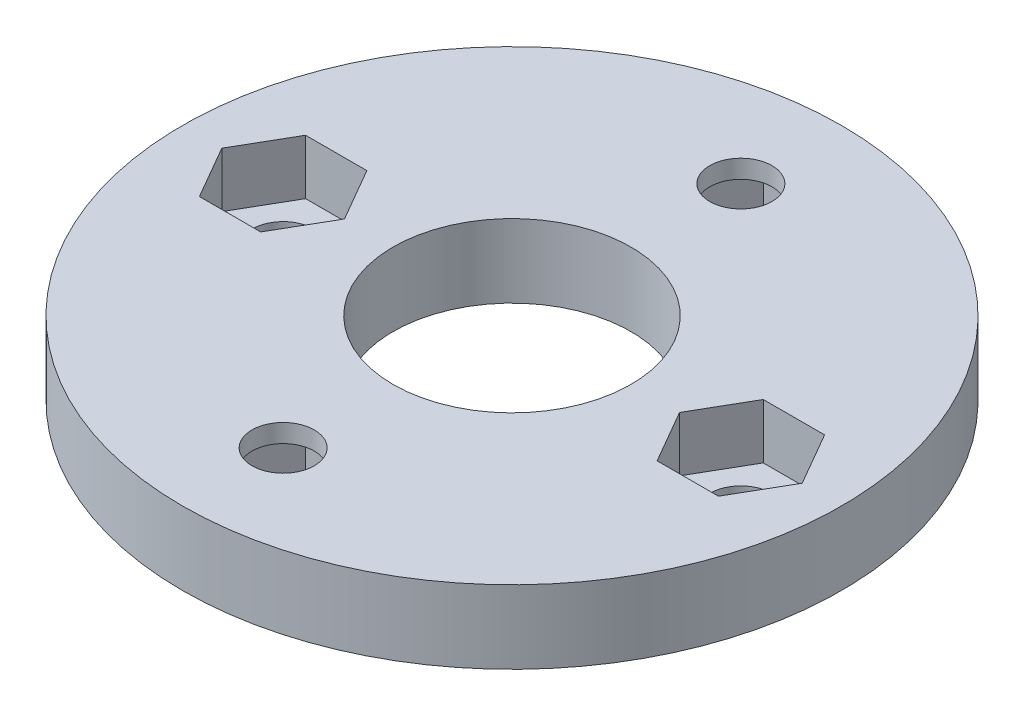
ISO-10303-21;
HEADER;
FILE_DESCRIPTION(('STEP AP214'),'2;1');
FILE_NAME('part.step','',(''),(''),'','','');
FILE_SCHEMA(('AUTOMOTIVE_DESIGN { 1 0 10303 214 1 1 1 1 }'));
ENDSEC;
DATA;
#1=APPLICATION_CONTEXT('core data for automotive mechanical design processes');
#2=APPLICATION_PROTOCOL_DEFINITION('international standard','automotive_design',2000,#1);
#3=PRODUCT_CONTEXT('',#1,'mechanical');
#4=PRODUCT('Part','Part','',(#3));
#5=PRODUCT_RELATED_PRODUCT_CATEGORY('part','',(#4));
#6=PRODUCT_DEFINITION_FORMATION('','',#4);
#7=PRODUCT_DEFINITION_CONTEXT('part definition',#1,'design');
#8=PRODUCT_DEFINITION('design','',#6,#7);
#9=PRODUCT_DEFINITION_SHAPE('','',#8);
#10=(LENGTH_UNIT() NAMED_UNIT(*) SI_UNIT(.MILLI.,.METRE.));
#11=(NAMED_UNIT(*) PLANE_ANGLE_UNIT() SI_UNIT($,.RADIAN.));
#12=(NAMED_UNIT(*) SI_UNIT($,.STERADIAN.) SOLID_ANGLE_UNIT());
#13=UNCERTAINTY_MEASURE_WITH_UNIT(LENGTH_MEASURE(1.E-05),#10,'distance_accuracy_value','');
#14=(GEOMETRIC_REPRESENTATION_CONTEXT(3) GLOBAL_UNCERTAINTY_ASSIGNED_CONTEXT((#13)) GLOBAL_UNIT_ASSIGNED_CONTEXT((#10,
#11,#12)) REPRESENTATION_CONTEXT('',''));
#15=CARTESIAN_POINT('',(0.,0.,0.));
#16=DIRECTION('',(0.,0.,1.));
#17=DIRECTION('',(1.,0.,0.));
#18=AXIS2_PLACEMENT_3D('',#15,#16,#17);
#19=CARTESIAN_POINT('',(0.,0.,-12.5));
#20=DIRECTION('',(0.,1.,0.));
#21=DIRECTION('',(0.,0.,1.));
#22=AXIS2_PLACEMENT_3D('',#19,#20,#21);
#23=CYLINDRICAL_SURFACE('',#22,1.7);
#24=CARTESIAN_POINT('',(0.,4.,-12.5));
#25=DIRECTION('',(0.,1.,0.));
#26=DIRECTION('',(1.,0.,0.));
#27=AXIS2_PLACEMENT_3D('',#24,#25,#26);
#28=CIRCLE('',#27,1.7);
#29=CARTESIAN_POINT('',(1.69999999999996,4.,-12.5));
#30=VERTEX_POINT('',#29);
#31=EDGE_CURVE('E306',#30,#30,#28,.T.);
#32=ORIENTED_EDGE('',*,*,#31,.T.);
#33=EDGE_LOOP('',(#32));
#34=FACE_BOUND('',#33,.T.);
#35=CARTESIAN_POINT('',(0.,3.,-12.5));
#36=DIRECTION('',(0.,-1.,0.));
#37=DIRECTION('',(0.,0.,-1.));
#38=AXIS2_PLACEMENT_3D('',#35,#36,#37);
#39=CIRCLE('',#38,1.7);
#40=CARTESIAN_POINT('',(0.,3.,-14.2));
#41=VERTEX_POINT('',#40);
#42=EDGE_CURVE('E38',#41,#41,#39,.F.);
#43=ORIENTED_EDGE('',*,*,#42,.F.);
#44=EDGE_LOOP('',(#43));
#45=FACE_BOUND('',#44,.T.);
#46=ADVANCED_FACE('F34',(#34,#45),#23,.F.);
#47=CARTESIAN_POINT('',(1.30930550206618E-13,0.,12.5));
#48=DIRECTION('',(0.,1.,0.));
#49=DIRECTION('',(0.,0.,1.));
#50=AXIS2_PLACEMENT_3D('',#47,#48,#49);
#51=CYLINDRICAL_SURFACE('',#50,1.7);
#52=CARTESIAN_POINT('',(1.30930550206618E-13,4.,12.5));
#53=DIRECTION('',(0.,1.,0.));
#54=DIRECTION('',(-1.,0.,0.));
#55=AXIS2_PLACEMENT_3D('',#52,#53,#54);
#56=CIRCLE('',#55,1.7);
#57=CARTESIAN_POINT('',(-1.69999999999987,4.,12.5));
#58=VERTEX_POINT('',#57);
#59=EDGE_CURVE('E303',#58,#58,#56,.T.);
#60=ORIENTED_EDGE('',*,*,#59,.T.);
#61=EDGE_LOOP('',(#60));
#62=FACE_BOUND('',#61,.T.);
#63=CARTESIAN_POINT('',(1.30930550206618E-13,3.,12.5));
#64=DIRECTION('',(0.,-1.,0.));
#65=DIRECTION('',(0.,0.,-1.));
#66=AXIS2_PLACEMENT_3D('',#63,#64,#65);
#67=CIRCLE('',#66,1.7);
#68=CARTESIAN_POINT('',(1.30930550206618E-13,3.,10.8));
#69=VERTEX_POINT('',#68);
#70=EDGE_CURVE('E246',#69,#69,#67,.F.);
#71=ORIENTED_EDGE('',*,*,#70,.F.);
#72=EDGE_LOOP('',(#71));
#73=FACE_BOUND('',#72,.T.);
#74=ADVANCED_FACE('F428',(#62,#73),#51,.F.);
#75=CARTESIAN_POINT('',(0.,4.,0.));
#76=DIRECTION('',(0.,1.,0.));
#77=DIRECTION('',(0.,0.,1.));
#78=AXIS2_PLACEMENT_3D('',#75,#76,#77);
#79=PLANE('',#78);
#80=ORIENTED_EDGE('',*,*,#59,.F.);
#81=EDGE_LOOP('',(#80));
#82=FACE_BOUND('',#81,.T.);
#83=ORIENTED_EDGE('',*,*,#31,.F.);
#84=EDGE_LOOP('',(#83));
#85=FACE_BOUND('',#84,.T.);
#86=DIRECTION('',(-0.49999994243347,0.,0.866025437020488));
#87=VECTOR('',#86,1.);
#88=CARTESIAN_POINT('',(-14.174315973419,4.,-2.8999998887047));
#89=LINE('',#88,#87);
#90=CARTESIAN_POINT('',(-14.174315973419,4.,-2.8999998887047));
#91=VERTEX_POINT('',#90);
#92=CARTESIAN_POINT('',(-15.8486315612998,4.,2.22590577046711E-07));
#93=VERTEX_POINT('',#92);
#94=EDGE_CURVE('E333',#91,#93,#89,.T.);
#95=ORIENTED_EDGE('',*,*,#94,.F.);
#96=DIRECTION('',(-0.999999999999998,0.,6.64721020233805E-08));
#97=VECTOR('',#96,1.);
#98=CARTESIAN_POINT('',(-10.8256844121192,4.,-2.90000011129528));
#99=LINE('',#98,#97);
#100=CARTESIAN_POINT('',(-10.8256844121192,4.,-2.90000011129528));
#101=VERTEX_POINT('',#100);
#102=EDGE_CURVE('E317',#101,#91,#99,.T.);
#103=ORIENTED_EDGE('',*,*,#102,.F.);
#104=DIRECTION('',(-0.500000057566528,0.,-0.866025370548386));
#105=VECTOR('',#104,1.);
#106=CARTESIAN_POINT('',(-9.15136843870021,4.,-2.22590574284896E-07));
#107=LINE('',#106,#105);
#108=CARTESIAN_POINT('',(-9.15136843870021,4.,-2.22590574284896E-07));
#109=VERTEX_POINT('',#108);
#110=EDGE_CURVE('E344',#109,#101,#107,.T.);
#111=ORIENTED_EDGE('',*,*,#110,.F.);
#112=DIRECTION('',(0.49999994243347,0.,-0.866025437020487));
#113=VECTOR('',#112,1.);
#114=CARTESIAN_POINT('',(-10.825684026581,4.,2.8999998887047));
#115=LINE('',#114,#113);
#116=CARTESIAN_POINT('',(-10.825684026581,4.,2.8999998887047));
#117=VERTEX_POINT('',#116);
#118=EDGE_CURVE('E341',#117,#109,#115,.T.);
#119=ORIENTED_EDGE('',*,*,#118,.F.);
#120=DIRECTION('',(0.999999999999998,0.,-6.64721020233805E-08));
#121=VECTOR('',#120,1.);
#122=CARTESIAN_POINT('',(-14.1743155878808,4.,2.90000011129528));
#123=LINE('',#122,#121);
#124=CARTESIAN_POINT('',(-14.1743155878808,4.,2.90000011129528));
#125=VERTEX_POINT('',#124);
#126=EDGE_CURVE('E338',#125,#117,#123,.T.);
#127=ORIENTED_EDGE('',*,*,#126,.F.);
#128=DIRECTION('',(0.500000057566528,0.,0.866025370548386));
#129=VECTOR('',#128,1.);
#130=CARTESIAN_POINT('',(-15.8486315612998,4.,2.2259057847389E-07));
#131=LINE('',#130,#129);
#132=EDGE_CURVE('E335',#93,#125,#131,.T.);
#133=ORIENTED_EDGE('',*,*,#132,.F.);
#134=EDGE_LOOP('',(#95,#103,#111,#119,#127,#133));
#135=FACE_BOUND('',#134,.T.);
#136=DIRECTION('',(0.5,0.,-0.866025403784438));
#137=VECTOR('',#136,1.);
#138=CARTESIAN_POINT('',(14.1743157806499,4.,2.90000083090127));
#139=LINE('',#138,#137);
#140=CARTESIAN_POINT('',(14.1743157806499,4.,2.90000083090127));
#141=VERTEX_POINT('',#140);
#142=CARTESIAN_POINT('',(15.8486315612998,4.,8.30901274000151E-07));
#143=VERTEX_POINT('',#142);
#144=EDGE_CURVE('E351',#141,#143,#139,.T.);
#145=ORIENTED_EDGE('',*,*,#144,.F.);
#146=DIRECTION('',(1.,0.,0.));
#147=VECTOR('',#146,1.);
#148=CARTESIAN_POINT('',(10.8256842193501,4.,2.90000083090127));
#149=LINE('',#148,#147);
#150=CARTESIAN_POINT('',(10.8256842193501,4.,2.90000083090127));
#151=VERTEX_POINT('',#150);
#152=EDGE_CURVE('E366',#151,#141,#149,.T.);
#153=ORIENTED_EDGE('',*,*,#152,.F.);
#154=DIRECTION('',(0.5,0.,0.866025403784439));
#155=VECTOR('',#154,1.);
#156=CARTESIAN_POINT('',(9.15136843870017,4.,8.30901269872044E-07));
#157=LINE('',#156,#155);
#158=CARTESIAN_POINT('',(9.15136843870017,4.,8.30901269872044E-07));
#159=VERTEX_POINT('',#158);
#160=EDGE_CURVE('E392',#159,#151,#157,.T.);
#161=ORIENTED_EDGE('',*,*,#160,.F.);
#162=DIRECTION('',(-0.5,0.,0.866025403784438));
#163=VECTOR('',#162,1.);
#164=CARTESIAN_POINT('',(10.8256842193501,4.,-2.89999916909873));
#165=LINE('',#164,#163);
#166=CARTESIAN_POINT('',(10.8256842193501,4.,-2.89999916909873));
#167=VERTEX_POINT('',#166);
#168=EDGE_CURVE('E389',#167,#159,#165,.T.);
#169=ORIENTED_EDGE('',*,*,#168,.F.);
#170=DIRECTION('',(-1.,0.,0.));
#171=VECTOR('',#170,1.);
#172=CARTESIAN_POINT('',(14.1743157806499,4.,-2.89999916909873));
#173=LINE('',#172,#171);
#174=CARTESIAN_POINT('',(14.1743157806499,4.,-2.89999916909873));
#175=VERTEX_POINT('',#174);
#176=EDGE_CURVE('E386',#175,#167,#173,.T.);
#177=ORIENTED_EDGE('',*,*,#176,.F.);
#178=DIRECTION('',(-0.5,0.,-0.866025403784439));
#179=VECTOR('',#178,1.);
#180=CARTESIAN_POINT('',(15.8486315612998,4.,8.30901274000151E-07));
#181=LINE('',#180,#179);
#182=EDGE_CURVE('E383',#143,#175,#181,.T.);
#183=ORIENTED_EDGE('',*,*,#182,.F.);
#184=EDGE_LOOP('',(#145,#153,#161,#169,#177,#183));
#185=FACE_BOUND('',#184,.T.);
#186=CARTESIAN_POINT('',(0.,4.,0.));
#187=DIRECTION('',(0.,1.,0.));
#188=DIRECTION('',(0.,0.,1.));
#189=AXIS2_PLACEMENT_3D('',#186,#187,#188);
#190=CIRCLE('',#189,18.);
#191=CARTESIAN_POINT('',(0.,4.,18.));
#192=VERTEX_POINT('',#191);
#193=EDGE_CURVE('E11',#192,#192,#190,.T.);
#194=ORIENTED_EDGE('',*,*,#193,.T.);
#195=EDGE_LOOP('',(#194));
#196=FACE_BOUND('',#195,.T.);
#197=CARTESIAN_POINT('',(0.,4.,0.));
#198=DIRECTION('',(0.,1.,0.));
#199=DIRECTION('',(0.,0.,1.));
#200=AXIS2_PLACEMENT_3D('',#197,#198,#199);
#201=CIRCLE('',#200,6.5);
#202=CARTESIAN_POINT('',(0.,4.,6.5));
#203=VERTEX_POINT('',#202);
#204=EDGE_CURVE('E410',#203,#203,#201,.T.);
#205=ORIENTED_EDGE('',*,*,#204,.F.);
#206=EDGE_LOOP('',(#205));
#207=FACE_BOUND('',#206,.T.);
#208=ADVANCED_FACE('F434',(#82,#85,#135,#185,#196,#207),#79,.T.);
#209=CARTESIAN_POINT('',(0.,0.,0.));
#210=DIRECTION('',(0.,1.,0.));
#211=DIRECTION('',(0.,0.,1.));
#212=AXIS2_PLACEMENT_3D('',#209,#210,#211);
#213=PLANE('',#212);
#214=DIRECTION('',(-0.5,0.,0.866025403784439));
#215=VECTOR('',#214,1.);
#216=CARTESIAN_POINT('',(3.34863156129983,0.,12.5));
#217=LINE('',#216,#215);
#218=CARTESIAN_POINT('',(3.34863156129983,0.,12.5));
#219=VERTEX_POINT('',#218);
#220=CARTESIAN_POINT('',(1.67431578064991,0.,15.4));
#221=VERTEX_POINT('',#220);
#222=EDGE_CURVE('E233',#219,#221,#217,.T.);
#223=ORIENTED_EDGE('',*,*,#222,.F.);
#224=DIRECTION('',(0.5,0.,0.866025403784439));
#225=VECTOR('',#224,1.);
#226=CARTESIAN_POINT('',(1.67431578064991,0.,9.6));
#227=LINE('',#226,#225);
#228=CARTESIAN_POINT('',(1.67431578064991,0.,9.6));
#229=VERTEX_POINT('',#228);
#230=EDGE_CURVE('E51',#229,#219,#227,.T.);
#231=ORIENTED_EDGE('',*,*,#230,.F.);
#232=DIRECTION('',(1.,0.,0.));
#233=VECTOR('',#232,1.);
#234=CARTESIAN_POINT('',(-1.67431578064992,0.,9.6));
#235=LINE('',#234,#233);
#236=CARTESIAN_POINT('',(-1.67431578064992,0.,9.6));
#237=VERTEX_POINT('',#236);
#238=EDGE_CURVE('E219',#237,#229,#235,.T.);
#239=ORIENTED_EDGE('',*,*,#238,.F.);
#240=DIRECTION('',(0.5,0.,-0.866025403784439));
#241=VECTOR('',#240,1.);
#242=CARTESIAN_POINT('',(-3.34863156129983,0.,12.5));
#243=LINE('',#242,#241);
#244=CARTESIAN_POINT('',(-3.34863156129983,0.,12.5));
#245=VERTEX_POINT('',#244);
#246=EDGE_CURVE('E222',#245,#237,#243,.T.);
#247=ORIENTED_EDGE('',*,*,#246,.F.);
#248=DIRECTION('',(-0.5,0.,-0.866025403784438));
#249=VECTOR('',#248,1.);
#250=CARTESIAN_POINT('',(-1.67431578064992,0.,15.4));
#251=LINE('',#250,#249);
#252=CARTESIAN_POINT('',(-1.67431578064992,0.,15.4));
#253=VERTEX_POINT('',#252);
#254=EDGE_CURVE('E239',#253,#245,#251,.T.);
#255=ORIENTED_EDGE('',*,*,#254,.F.);
#256=DIRECTION('',(-1.,0.,0.));
#257=VECTOR('',#256,1.);
#258=CARTESIAN_POINT('',(1.67431578064991,0.,15.4));
#259=LINE('',#258,#257);
#260=EDGE_CURVE('E236',#221,#253,#259,.T.);
#261=ORIENTED_EDGE('',*,*,#260,.F.);
#262=EDGE_LOOP('',(#223,#231,#239,#247,#255,#261));
#263=FACE_BOUND('',#262,.T.);
#264=DIRECTION('',(0.500000000000006,0.,-0.866025403784435));
#265=VECTOR('',#264,1.);
#266=CARTESIAN_POINT('',(-3.34863156129974,0.,-12.5));
#267=LINE('',#266,#265);
#268=CARTESIAN_POINT('',(-3.34863156129974,0.,-12.5));
#269=VERTEX_POINT('',#268);
#270=CARTESIAN_POINT('',(-1.67431578064981,0.,-15.4));
#271=VERTEX_POINT('',#270);
#272=EDGE_CURVE('E275',#269,#271,#267,.T.);
#273=ORIENTED_EDGE('',*,*,#272,.F.);
#274=DIRECTION('',(-0.499999999999994,0.,-0.866025403784442));
#275=VECTOR('',#274,1.);
#276=CARTESIAN_POINT('',(-1.67431578064985,0.,-9.60000000000001));
#277=LINE('',#276,#275);
#278=CARTESIAN_POINT('',(-1.67431578064985,0.,-9.60000000000001));
#279=VERTEX_POINT('',#278);
#280=EDGE_CURVE('E59',#279,#269,#277,.T.);
#281=ORIENTED_EDGE('',*,*,#280,.F.);
#282=DIRECTION('',(-1.,0.,0.));
#283=VECTOR('',#282,1.);
#284=CARTESIAN_POINT('',(1.67431578064998,0.,-9.59999999999999));
#285=LINE('',#284,#283);
#286=CARTESIAN_POINT('',(1.67431578064998,0.,-9.59999999999999));
#287=VERTEX_POINT('',#286);
#288=EDGE_CURVE('E258',#287,#279,#285,.T.);
#289=ORIENTED_EDGE('',*,*,#288,.F.);
#290=DIRECTION('',(-0.500000000000006,0.,0.866025403784435));
#291=VECTOR('',#290,1.);
#292=CARTESIAN_POINT('',(3.34863156129991,0.,-12.5));
#293=LINE('',#292,#291);
#294=CARTESIAN_POINT('',(3.34863156129991,0.,-12.5));
#295=VERTEX_POINT('',#294);
#296=EDGE_CURVE('E284',#295,#287,#293,.T.);
#297=ORIENTED_EDGE('',*,*,#296,.F.);
#298=DIRECTION('',(0.499999999999994,0.,0.866025403784442));
#299=VECTOR('',#298,1.);
#300=CARTESIAN_POINT('',(1.67431578065002,0.,-15.4));
#301=LINE('',#300,#299);
#302=CARTESIAN_POINT('',(1.67431578065002,0.,-15.4));
#303=VERTEX_POINT('',#302);
#304=EDGE_CURVE('E281',#303,#295,#301,.T.);
#305=ORIENTED_EDGE('',*,*,#304,.F.);
#306=DIRECTION('',(1.,0.,0.));
#307=VECTOR('',#306,1.);
#308=CARTESIAN_POINT('',(-1.67431578064981,0.,-15.4));
#309=LINE('',#308,#307);
#310=EDGE_CURVE('E278',#271,#303,#309,.T.);
#311=ORIENTED_EDGE('',*,*,#310,.F.);
#312=EDGE_LOOP('',(#273,#281,#289,#297,#305,#311));
#313=FACE_BOUND('',#312,.T.);
#314=CARTESIAN_POINT('',(-12.5,0.,0.));
#315=DIRECTION('',(0.,1.,0.));
#316=DIRECTION('',(0.,0.,-1.));
#317=AXIS2_PLACEMENT_3D('',#314,#315,#316);
#318=CIRCLE('',#317,1.7);
#319=CARTESIAN_POINT('',(-12.5,0.,-1.7));
#320=VERTEX_POINT('',#319);
#321=EDGE_CURVE('E299',#320,#320,#318,.T.);
#322=ORIENTED_EDGE('',*,*,#321,.T.);
#323=EDGE_LOOP('',(#322));
#324=FACE_BOUND('',#323,.T.);
#325=CARTESIAN_POINT('',(12.5,0.,0.));
#326=DIRECTION('',(0.,1.,0.));
#327=DIRECTION('',(0.,0.,1.));
#328=AXIS2_PLACEMENT_3D('',#325,#326,#327);
#329=CIRCLE('',#328,1.7);
#330=CARTESIAN_POINT('',(12.5,0.,1.7));
#331=VERTEX_POINT('',#330);
#332=EDGE_CURVE('E309',#331,#331,#329,.T.);
#333=ORIENTED_EDGE('',*,*,#332,.T.);
#334=EDGE_LOOP('',(#333));
#335=FACE_BOUND('',#334,.T.);
#336=CARTESIAN_POINT('',(0.,0.,0.));
#337=DIRECTION('',(0.,1.,0.));
#338=DIRECTION('',(0.,0.,1.));
#339=AXIS2_PLACEMENT_3D('',#336,#337,#338);
#340=CIRCLE('',#339,18.);
#341=CARTESIAN_POINT('',(0.,0.,18.));
#342=VERTEX_POINT('',#341);
#343=EDGE_CURVE('E43',#342,#342,#340,.T.);
#344=ORIENTED_EDGE('',*,*,#343,.F.);
#345=EDGE_LOOP('',(#344));
#346=FACE_BOUND('',#345,.T.);
#347=CARTESIAN_POINT('',(0.,0.,0.));
#348=DIRECTION('',(0.,1.,0.));
#349=DIRECTION('',(0.,0.,1.));
#350=AXIS2_PLACEMENT_3D('',#347,#348,#349);
#351=CIRCLE('',#350,6.5);
#352=CARTESIAN_POINT('',(0.,0.,6.5));
#353=VERTEX_POINT('',#352);
#354=EDGE_CURVE('E399',#353,#353,#351,.T.);
#355=ORIENTED_EDGE('',*,*,#354,.T.);
#356=EDGE_LOOP('',(#355));
#357=FACE_BOUND('',#356,.T.);
#358=ADVANCED_FACE('F505',(#263,#313,#324,#335,#346,#357),#213,.F.);
#359=CARTESIAN_POINT('',(0.,4.,0.));
#360=DIRECTION('',(0.,-1.,0.));
#361=DIRECTION('',(0.,0.,-1.));
#362=AXIS2_PLACEMENT_3D('',#359,#360,#361);
#363=CYLINDRICAL_SURFACE('',#362,18.);
#364=ORIENTED_EDGE('',*,*,#193,.F.);
#365=EDGE_LOOP('',(#364));
#366=FACE_BOUND('',#365,.T.);
#367=ORIENTED_EDGE('',*,*,#343,.T.);
#368=EDGE_LOOP('',(#367));
#369=FACE_BOUND('',#368,.T.);
#370=ADVANCED_FACE('F36',(#366,#369),#363,.T.);
#371=CARTESIAN_POINT('',(0.,4.,0.));
#372=DIRECTION('',(0.,-1.,0.));
#373=DIRECTION('',(0.,0.,-1.));
#374=AXIS2_PLACEMENT_3D('',#371,#372,#373);
#375=CYLINDRICAL_SURFACE('',#374,6.5);
#376=ORIENTED_EDGE('',*,*,#204,.T.);
#377=EDGE_LOOP('',(#376));
#378=FACE_BOUND('',#377,.T.);
#379=ORIENTED_EDGE('',*,*,#354,.F.);
#380=EDGE_LOOP('',(#379));
#381=FACE_BOUND('',#380,.T.);
#382=ADVANCED_FACE('F499',(#378,#381),#375,.F.);
#383=CARTESIAN_POINT('',(14.1743157806499,1.,2.90000083090127));
#384=DIRECTION('',(0.866025403784438,0.,0.5));
#385=DIRECTION('',(0.5,0.,-0.866025403784438));
#386=AXIS2_PLACEMENT_3D('',#383,#384,#385);
#387=PLANE('',#386);
#388=ORIENTED_EDGE('',*,*,#144,.T.);
#389=DIRECTION('',(0.,1.,0.));
#390=VECTOR('',#389,1.);
#391=CARTESIAN_POINT('',(15.8486315612998,1.,8.30901274000151E-07));
#392=LINE('',#391,#390);
#393=CARTESIAN_POINT('',(15.8486315612998,1.,8.30901274000151E-07));
#394=VERTEX_POINT('',#393);
#395=EDGE_CURVE('E381',#394,#143,#392,.T.);
#396=ORIENTED_EDGE('',*,*,#395,.F.);
#397=DIRECTION('',(0.5,0.,-0.866025403784438));
#398=VECTOR('',#397,1.);
#399=CARTESIAN_POINT('',(14.1743157806499,1.,2.90000083090127));
#400=LINE('',#399,#398);
#401=CARTESIAN_POINT('',(14.1743157806499,1.,2.90000083090127));
#402=VERTEX_POINT('',#401);
#403=EDGE_CURVE('E362',#402,#394,#400,.T.);
#404=ORIENTED_EDGE('',*,*,#403,.F.);
#405=DIRECTION('',(0.,1.,0.));
#406=VECTOR('',#405,1.);
#407=CARTESIAN_POINT('',(14.1743157806499,1.,2.90000083090127));
#408=LINE('',#407,#406);
#409=EDGE_CURVE('E397',#402,#141,#408,.T.);
#410=ORIENTED_EDGE('',*,*,#409,.T.);
#411=EDGE_LOOP('',(#388,#396,#404,#410));
#412=FACE_BOUND('',#411,.T.);
#413=ADVANCED_FACE('F481',(#412),#387,.F.);
#414=CARTESIAN_POINT('',(10.8256842193501,1.,2.90000083090127));
#415=DIRECTION('',(0.,0.,1.));
#416=DIRECTION('',(1.,0.,0.));
#417=AXIS2_PLACEMENT_3D('',#414,#415,#416);
#418=PLANE('',#417);
#419=ORIENTED_EDGE('',*,*,#152,.T.);
#420=ORIENTED_EDGE('',*,*,#409,.F.);
#421=DIRECTION('',(1.,0.,0.));
#422=VECTOR('',#421,1.);
#423=CARTESIAN_POINT('',(10.8256842193501,1.,2.90000083090127));
#424=LINE('',#423,#422);
#425=CARTESIAN_POINT('',(10.8256842193501,1.,2.90000083090127));
#426=VERTEX_POINT('',#425);
#427=EDGE_CURVE('E378',#426,#402,#424,.T.);
#428=ORIENTED_EDGE('',*,*,#427,.F.);
#429=DIRECTION('',(0.,1.,0.));
#430=VECTOR('',#429,1.);
#431=CARTESIAN_POINT('',(10.8256842193501,1.,2.90000083090127));
#432=LINE('',#431,#430);
#433=EDGE_CURVE('E400',#426,#151,#432,.T.);
#434=ORIENTED_EDGE('',*,*,#433,.T.);
#435=EDGE_LOOP('',(#419,#420,#428,#434));
#436=FACE_BOUND('',#435,.T.);
#437=ADVANCED_FACE('F477',(#436),#418,.F.);
#438=CARTESIAN_POINT('',(9.15136843870017,1.,8.30901269872044E-07));
#439=DIRECTION('',(-0.866025403784439,0.,0.5));
#440=DIRECTION('',(0.5,0.,0.866025403784439));
#441=AXIS2_PLACEMENT_3D('',#438,#439,#440);
#442=PLANE('',#441);
#443=ORIENTED_EDGE('',*,*,#160,.T.);
#444=ORIENTED_EDGE('',*,*,#433,.F.);
#445=DIRECTION('',(0.5,0.,0.866025403784439));
#446=VECTOR('',#445,1.);
#447=CARTESIAN_POINT('',(9.15136843870017,1.,8.30901269872044E-07));
#448=LINE('',#447,#446);
#449=CARTESIAN_POINT('',(9.15136843870017,1.,8.30901269872044E-07));
#450=VERTEX_POINT('',#449);
#451=EDGE_CURVE('E375',#450,#426,#448,.T.);
#452=ORIENTED_EDGE('',*,*,#451,.F.);
#453=DIRECTION('',(0.,1.,0.));
#454=VECTOR('',#453,1.);
#455=CARTESIAN_POINT('',(9.15136843870017,1.,8.30901269872044E-07));
#456=LINE('',#455,#454);
#457=EDGE_CURVE('E402',#450,#159,#456,.T.);
#458=ORIENTED_EDGE('',*,*,#457,.T.);
#459=EDGE_LOOP('',(#443,#444,#452,#458));
#460=FACE_BOUND('',#459,.T.);
#461=ADVANCED_FACE('F480',(#460),#442,.F.);
#462=CARTESIAN_POINT('',(10.8256842193501,1.,-2.89999916909873));
#463=DIRECTION('',(-0.866025403784438,0.,-0.5));
#464=DIRECTION('',(-0.5,0.,0.866025403784438));
#465=AXIS2_PLACEMENT_3D('',#462,#463,#464);
#466=PLANE('',#465);
#467=ORIENTED_EDGE('',*,*,#168,.T.);
#468=ORIENTED_EDGE('',*,*,#457,.F.);
#469=DIRECTION('',(-0.5,0.,0.866025403784438));
#470=VECTOR('',#469,1.);
#471=CARTESIAN_POINT('',(10.8256842193501,1.,-2.89999916909873));
#472=LINE('',#471,#470);
#473=CARTESIAN_POINT('',(10.8256842193501,1.,-2.89999916909873));
#474=VERTEX_POINT('',#473);
#475=EDGE_CURVE('E372',#474,#450,#472,.T.);
#476=ORIENTED_EDGE('',*,*,#475,.F.);
#477=DIRECTION('',(0.,1.,0.));
#478=VECTOR('',#477,1.);
#479=CARTESIAN_POINT('',(10.8256842193501,1.,-2.89999916909873));
#480=LINE('',#479,#478);
#481=EDGE_CURVE('E404',#474,#167,#480,.T.);
#482=ORIENTED_EDGE('',*,*,#481,.T.);
#483=EDGE_LOOP('',(#467,#468,#476,#482));
#484=FACE_BOUND('',#483,.T.);
#485=ADVANCED_FACE('F485',(#484),#466,.F.);
#486=CARTESIAN_POINT('',(14.1743157806499,1.,-2.89999916909873));
#487=DIRECTION('',(0.,0.,-1.));
#488=DIRECTION('',(-1.,0.,0.));
#489=AXIS2_PLACEMENT_3D('',#486,#487,#488);
#490=PLANE('',#489);
#491=ORIENTED_EDGE('',*,*,#176,.T.);
#492=ORIENTED_EDGE('',*,*,#481,.F.);
#493=DIRECTION('',(-1.,0.,0.));
#494=VECTOR('',#493,1.);
#495=CARTESIAN_POINT('',(14.1743157806499,1.,-2.89999916909873));
#496=LINE('',#495,#494);
#497=CARTESIAN_POINT('',(14.1743157806499,1.,-2.89999916909873));
#498=VERTEX_POINT('',#497);
#499=EDGE_CURVE('E369',#498,#474,#496,.T.);
#500=ORIENTED_EDGE('',*,*,#499,.F.);
#501=DIRECTION('',(0.,1.,0.));
#502=VECTOR('',#501,1.);
#503=CARTESIAN_POINT('',(14.1743157806499,1.,-2.89999916909873));
#504=LINE('',#503,#502);
#505=EDGE_CURVE('E406',#498,#175,#504,.T.);
#506=ORIENTED_EDGE('',*,*,#505,.T.);
#507=EDGE_LOOP('',(#491,#492,#500,#506));
#508=FACE_BOUND('',#507,.T.);
#509=ADVANCED_FACE('F489',(#508),#490,.F.);
#510=CARTESIAN_POINT('',(15.8486315612998,1.,8.30901274000151E-07));
#511=DIRECTION('',(0.866025403784439,0.,-0.5));
#512=DIRECTION('',(-0.5,0.,-0.866025403784439));
#513=AXIS2_PLACEMENT_3D('',#510,#511,#512);
#514=PLANE('',#513);
#515=ORIENTED_EDGE('',*,*,#182,.T.);
#516=ORIENTED_EDGE('',*,*,#505,.F.);
#517=DIRECTION('',(-0.5,0.,-0.866025403784439));
#518=VECTOR('',#517,1.);
#519=CARTESIAN_POINT('',(15.8486315612998,1.,8.30901274000151E-07));
#520=LINE('',#519,#518);
#521=EDGE_CURVE('E365',#394,#498,#520,.T.);
#522=ORIENTED_EDGE('',*,*,#521,.F.);
#523=ORIENTED_EDGE('',*,*,#395,.T.);
#524=EDGE_LOOP('',(#515,#516,#522,#523));
#525=FACE_BOUND('',#524,.T.);
#526=ADVANCED_FACE('F475',(#525),#514,.F.);
#527=CARTESIAN_POINT('',(0.,1.,0.));
#528=DIRECTION('',(0.,1.,0.));
#529=DIRECTION('',(0.,0.,1.));
#530=AXIS2_PLACEMENT_3D('',#527,#528,#529);
#531=PLANE('',#530);
#532=CARTESIAN_POINT('',(12.5,1.,0.));
#533=DIRECTION('',(0.,1.,0.));
#534=DIRECTION('',(0.,0.,1.));
#535=AXIS2_PLACEMENT_3D('',#532,#533,#534);
#536=CIRCLE('',#535,1.7);
#537=CARTESIAN_POINT('',(12.5,1.,1.7));
#538=VERTEX_POINT('',#537);
#539=EDGE_CURVE('E312',#538,#538,#536,.T.);
#540=ORIENTED_EDGE('',*,*,#539,.F.);
#541=EDGE_LOOP('',(#540));
#542=FACE_BOUND('',#541,.T.);
#543=ORIENTED_EDGE('',*,*,#403,.T.);
#544=ORIENTED_EDGE('',*,*,#521,.T.);
#545=ORIENTED_EDGE('',*,*,#499,.T.);
#546=ORIENTED_EDGE('',*,*,#475,.T.);
#547=ORIENTED_EDGE('',*,*,#451,.T.);
#548=ORIENTED_EDGE('',*,*,#427,.T.);
#549=EDGE_LOOP('',(#543,#544,#545,#546,#547,#548));
#550=FACE_BOUND('',#549,.T.);
#551=ADVANCED_FACE('F471',(#542,#550),#531,.T.);
#552=CARTESIAN_POINT('',(-14.174315973419,1.,-2.8999998887047));
#553=DIRECTION('',(-0.866025437020488,0.,-0.49999994243347));
#554=DIRECTION('',(-0.49999994243347,0.,0.866025437020488));
#555=AXIS2_PLACEMENT_3D('',#552,#553,#554);
#556=PLANE('',#555);
#557=ORIENTED_EDGE('',*,*,#94,.T.);
#558=DIRECTION('',(0.,1.,0.));
#559=VECTOR('',#558,1.);
#560=CARTESIAN_POINT('',(-15.8486315612998,1.,2.2259057847389E-07));
#561=LINE('',#560,#559);
#562=CARTESIAN_POINT('',(-15.8486315612998,1.,2.2259057847389E-07));
#563=VERTEX_POINT('',#562);
#564=EDGE_CURVE('E332',#563,#93,#561,.T.);
#565=ORIENTED_EDGE('',*,*,#564,.F.);
#566=DIRECTION('',(-0.49999994243347,0.,0.866025437020488));
#567=VECTOR('',#566,1.);
#568=CARTESIAN_POINT('',(-14.174315973419,1.,-2.8999998887047));
#569=LINE('',#568,#567);
#570=CARTESIAN_POINT('',(-14.174315973419,1.,-2.8999998887047));
#571=VERTEX_POINT('',#570);
#572=EDGE_CURVE('E313',#571,#563,#569,.T.);
#573=ORIENTED_EDGE('',*,*,#572,.F.);
#574=DIRECTION('',(0.,1.,0.));
#575=VECTOR('',#574,1.);
#576=CARTESIAN_POINT('',(-14.174315973419,1.,-2.8999998887047));
#577=LINE('',#576,#575);
#578=EDGE_CURVE('E349',#571,#91,#577,.T.);
#579=ORIENTED_EDGE('',*,*,#578,.T.);
#580=EDGE_LOOP('',(#557,#565,#573,#579));
#581=FACE_BOUND('',#580,.T.);
#582=ADVANCED_FACE('F453',(#581),#556,.F.);
#583=CARTESIAN_POINT('',(-10.8256844121192,1.,-2.90000011129528));
#584=DIRECTION('',(-6.64721020233805E-08,0.,-0.999999999999998));
#585=DIRECTION('',(-0.999999999999998,0.,6.64721020233805E-08));
#586=AXIS2_PLACEMENT_3D('',#583,#584,#585);
#587=PLANE('',#586);
#588=ORIENTED_EDGE('',*,*,#102,.T.);
#589=ORIENTED_EDGE('',*,*,#578,.F.);
#590=DIRECTION('',(-0.999999999999998,0.,6.64721020233805E-08));
#591=VECTOR('',#590,1.);
#592=CARTESIAN_POINT('',(-10.8256844121192,1.,-2.90000011129528));
#593=LINE('',#592,#591);
#594=CARTESIAN_POINT('',(-10.8256844121192,1.,-2.90000011129528));
#595=VERTEX_POINT('',#594);
#596=EDGE_CURVE('E329',#595,#571,#593,.T.);
#597=ORIENTED_EDGE('',*,*,#596,.F.);
#598=DIRECTION('',(0.,1.,0.));
#599=VECTOR('',#598,1.);
#600=CARTESIAN_POINT('',(-10.8256844121192,1.,-2.90000011129528));
#601=LINE('',#600,#599);
#602=EDGE_CURVE('E352',#595,#101,#601,.T.);
#603=ORIENTED_EDGE('',*,*,#602,.T.);
#604=EDGE_LOOP('',(#588,#589,#597,#603));
#605=FACE_BOUND('',#604,.T.);
#606=ADVANCED_FACE('F449',(#605),#587,.F.);
#607=CARTESIAN_POINT('',(-9.15136843870021,1.,-2.22590574284896E-07));
#608=DIRECTION('',(0.866025370548386,0.,-0.500000057566528));
#609=DIRECTION('',(-0.500000057566528,0.,-0.866025370548386));
#610=AXIS2_PLACEMENT_3D('',#607,#608,#609);
#611=PLANE('',#610);
#612=ORIENTED_EDGE('',*,*,#110,.T.);
#613=ORIENTED_EDGE('',*,*,#602,.F.);
#614=DIRECTION('',(-0.500000057566528,0.,-0.866025370548386));
#615=VECTOR('',#614,1.);
#616=CARTESIAN_POINT('',(-9.15136843870021,1.,-2.22590574284896E-07));
#617=LINE('',#616,#615);
#618=CARTESIAN_POINT('',(-9.15136843870021,1.,-2.22590574284896E-07));
#619=VERTEX_POINT('',#618);
#620=EDGE_CURVE('E326',#619,#595,#617,.T.);
#621=ORIENTED_EDGE('',*,*,#620,.F.);
#622=DIRECTION('',(0.,1.,0.));
#623=VECTOR('',#622,1.);
#624=CARTESIAN_POINT('',(-9.15136843870021,1.,-2.22590574284896E-07));
#625=LINE('',#624,#623);
#626=EDGE_CURVE('E354',#619,#109,#625,.T.);
#627=ORIENTED_EDGE('',*,*,#626,.T.);
#628=EDGE_LOOP('',(#612,#613,#621,#627));
#629=FACE_BOUND('',#628,.T.);
#630=ADVANCED_FACE('F452',(#629),#611,.F.);
#631=CARTESIAN_POINT('',(-10.825684026581,1.,2.8999998887047));
#632=DIRECTION('',(0.866025437020488,0.,0.49999994243347));
#633=DIRECTION('',(0.49999994243347,0.,-0.866025437020488));
#634=AXIS2_PLACEMENT_3D('',#631,#632,#633);
#635=PLANE('',#634);
#636=ORIENTED_EDGE('',*,*,#118,.T.);
#637=ORIENTED_EDGE('',*,*,#626,.F.);
#638=DIRECTION('',(0.49999994243347,0.,-0.866025437020487));
#639=VECTOR('',#638,1.);
#640=CARTESIAN_POINT('',(-10.825684026581,1.,2.8999998887047));
#641=LINE('',#640,#639);
#642=CARTESIAN_POINT('',(-10.825684026581,1.,2.8999998887047));
#643=VERTEX_POINT('',#642);
#644=EDGE_CURVE('E323',#643,#619,#641,.T.);
#645=ORIENTED_EDGE('',*,*,#644,.F.);
#646=DIRECTION('',(0.,1.,0.));
#647=VECTOR('',#646,1.);
#648=CARTESIAN_POINT('',(-10.825684026581,1.,2.8999998887047));
#649=LINE('',#648,#647);
#650=EDGE_CURVE('E356',#643,#117,#649,.T.);
#651=ORIENTED_EDGE('',*,*,#650,.T.);
#652=EDGE_LOOP('',(#636,#637,#645,#651));
#653=FACE_BOUND('',#652,.T.);
#654=ADVANCED_FACE('F457',(#653),#635,.F.);
#655=CARTESIAN_POINT('',(-14.1743155878808,1.,2.90000011129528));
#656=DIRECTION('',(6.64721020233805E-08,0.,0.999999999999998));
#657=DIRECTION('',(0.999999999999998,0.,-6.64721020233805E-08));
#658=AXIS2_PLACEMENT_3D('',#655,#656,#657);
#659=PLANE('',#658);
#660=ORIENTED_EDGE('',*,*,#126,.T.);
#661=ORIENTED_EDGE('',*,*,#650,.F.);
#662=DIRECTION('',(0.999999999999998,0.,-6.64721020233805E-08));
#663=VECTOR('',#662,1.);
#664=CARTESIAN_POINT('',(-14.1743155878808,1.,2.90000011129528));
#665=LINE('',#664,#663);
#666=CARTESIAN_POINT('',(-14.1743155878808,1.,2.90000011129528));
#667=VERTEX_POINT('',#666);
#668=EDGE_CURVE('E320',#667,#643,#665,.T.);
#669=ORIENTED_EDGE('',*,*,#668,.F.);
#670=DIRECTION('',(0.,1.,0.));
#671=VECTOR('',#670,1.);
#672=CARTESIAN_POINT('',(-14.1743155878808,1.,2.90000011129528));
#673=LINE('',#672,#671);
#674=EDGE_CURVE('E358',#667,#125,#673,.T.);
#675=ORIENTED_EDGE('',*,*,#674,.T.);
#676=EDGE_LOOP('',(#660,#661,#669,#675));
#677=FACE_BOUND('',#676,.T.);
#678=ADVANCED_FACE('F461',(#677),#659,.F.);
#679=CARTESIAN_POINT('',(-15.8486315612998,1.,2.2259057847389E-07));
#680=DIRECTION('',(-0.866025370548386,0.,0.500000057566528));
#681=DIRECTION('',(0.500000057566528,0.,0.866025370548386));
#682=AXIS2_PLACEMENT_3D('',#679,#680,#681);
#683=PLANE('',#682);
#684=ORIENTED_EDGE('',*,*,#132,.T.);
#685=ORIENTED_EDGE('',*,*,#674,.F.);
#686=DIRECTION('',(0.500000057566528,0.,0.866025370548386));
#687=VECTOR('',#686,1.);
#688=CARTESIAN_POINT('',(-15.8486315612998,1.,2.2259057847389E-07));
#689=LINE('',#688,#687);
#690=EDGE_CURVE('E316',#563,#667,#689,.T.);
#691=ORIENTED_EDGE('',*,*,#690,.F.);
#692=ORIENTED_EDGE('',*,*,#564,.T.);
#693=EDGE_LOOP('',(#684,#685,#691,#692));
#694=FACE_BOUND('',#693,.T.);
#695=ADVANCED_FACE('F447',(#694),#683,.F.);
#696=CARTESIAN_POINT('',(0.,1.,0.));
#697=DIRECTION('',(0.,1.,0.));
#698=DIRECTION('',(0.,0.,1.));
#699=AXIS2_PLACEMENT_3D('',#696,#697,#698);
#700=PLANE('',#699);
#701=CARTESIAN_POINT('',(-12.5,1.,0.));
#702=DIRECTION('',(0.,1.,0.));
#703=DIRECTION('',(0.,0.,1.));
#704=AXIS2_PLACEMENT_3D('',#701,#702,#703);
#705=CIRCLE('',#704,1.7);
#706=CARTESIAN_POINT('',(-12.5,1.,1.7));
#707=VERTEX_POINT('',#706);
#708=EDGE_CURVE('E302',#707,#707,#705,.T.);
#709=ORIENTED_EDGE('',*,*,#708,.F.);
#710=EDGE_LOOP('',(#709));
#711=FACE_BOUND('',#710,.T.);
#712=ORIENTED_EDGE('',*,*,#572,.T.);
#713=ORIENTED_EDGE('',*,*,#690,.T.);
#714=ORIENTED_EDGE('',*,*,#668,.T.);
#715=ORIENTED_EDGE('',*,*,#644,.T.);
#716=ORIENTED_EDGE('',*,*,#620,.T.);
#717=ORIENTED_EDGE('',*,*,#596,.T.);
#718=EDGE_LOOP('',(#712,#713,#714,#715,#716,#717));
#719=FACE_BOUND('',#718,.T.);
#720=ADVANCED_FACE('F443',(#711,#719),#700,.T.);
#721=CARTESIAN_POINT('',(12.5,0.,0.));
#722=DIRECTION('',(0.,1.,0.));
#723=DIRECTION('',(0.,0.,1.));
#724=AXIS2_PLACEMENT_3D('',#721,#722,#723);
#725=CYLINDRICAL_SURFACE('',#724,1.7);
#726=ORIENTED_EDGE('',*,*,#539,.T.);
#727=EDGE_LOOP('',(#726));
#728=FACE_BOUND('',#727,.T.);
#729=ORIENTED_EDGE('',*,*,#332,.F.);
#730=EDGE_LOOP('',(#729));
#731=FACE_BOUND('',#730,.T.);
#732=ADVANCED_FACE('F439',(#728,#731),#725,.F.);
#733=CARTESIAN_POINT('',(-12.5,0.,0.));
#734=DIRECTION('',(0.,1.,0.));
#735=DIRECTION('',(0.,0.,1.));
#736=AXIS2_PLACEMENT_3D('',#733,#734,#735);
#737=CYLINDRICAL_SURFACE('',#736,1.7);
#738=ORIENTED_EDGE('',*,*,#708,.T.);
#739=EDGE_LOOP('',(#738));
#740=FACE_BOUND('',#739,.T.);
#741=ORIENTED_EDGE('',*,*,#321,.F.);
#742=EDGE_LOOP('',(#741));
#743=FACE_BOUND('',#742,.T.);
#744=ADVANCED_FACE('F442',(#740,#743),#737,.F.);
#745=CARTESIAN_POINT('',(0.,3.,0.));
#746=DIRECTION('',(0.,-1.,0.));
#747=DIRECTION('',(0.,0.,-1.));
#748=AXIS2_PLACEMENT_3D('',#745,#746,#747);
#749=PLANE('',#748);
#750=DIRECTION('',(0.5,0.,0.866025403784439));
#751=VECTOR('',#750,1.);
#752=CARTESIAN_POINT('',(1.67431578064991,3.,9.6));
#753=LINE('',#752,#751);
#754=CARTESIAN_POINT('',(1.67431578064991,3.,9.6));
#755=VERTEX_POINT('',#754);
#756=CARTESIAN_POINT('',(3.34863156129983,3.,12.5));
#757=VERTEX_POINT('',#756);
#758=EDGE_CURVE('E199',#755,#757,#753,.T.);
#759=ORIENTED_EDGE('',*,*,#758,.T.);
#760=DIRECTION('',(-0.5,0.,0.866025403784439));
#761=VECTOR('',#760,1.);
#762=CARTESIAN_POINT('',(3.34863156129983,3.,12.5));
#763=LINE('',#762,#761);
#764=CARTESIAN_POINT('',(1.67431578064991,3.,15.4));
#765=VERTEX_POINT('',#764);
#766=EDGE_CURVE('E208',#757,#765,#763,.T.);
#767=ORIENTED_EDGE('',*,*,#766,.T.);
#768=DIRECTION('',(-1.,0.,0.));
#769=VECTOR('',#768,1.);
#770=CARTESIAN_POINT('',(1.67431578064991,3.,15.4));
#771=LINE('',#770,#769);
#772=CARTESIAN_POINT('',(-1.67431578064992,3.,15.4));
#773=VERTEX_POINT('',#772);
#774=EDGE_CURVE('E213',#765,#773,#771,.T.);
#775=ORIENTED_EDGE('',*,*,#774,.T.);
#776=DIRECTION('',(-0.5,0.,-0.866025403784438));
#777=VECTOR('',#776,1.);
#778=CARTESIAN_POINT('',(-1.67431578064992,3.,15.4));
#779=LINE('',#778,#777);
#780=CARTESIAN_POINT('',(-3.34863156129983,3.,12.5));
#781=VERTEX_POINT('',#780);
#782=EDGE_CURVE('E226',#773,#781,#779,.T.);
#783=ORIENTED_EDGE('',*,*,#782,.T.);
#784=DIRECTION('',(0.5,0.,-0.866025403784439));
#785=VECTOR('',#784,1.);
#786=CARTESIAN_POINT('',(-3.34863156129983,3.,12.5));
#787=LINE('',#786,#785);
#788=CARTESIAN_POINT('',(-1.67431578064992,3.,9.6));
#789=VERTEX_POINT('',#788);
#790=EDGE_CURVE('E229',#781,#789,#787,.T.);
#791=ORIENTED_EDGE('',*,*,#790,.T.);
#792=DIRECTION('',(1.,0.,0.));
#793=VECTOR('',#792,1.);
#794=CARTESIAN_POINT('',(-1.67431578064992,3.,9.6));
#795=LINE('',#794,#793);
#796=EDGE_CURVE('E205',#789,#755,#795,.T.);
#797=ORIENTED_EDGE('',*,*,#796,.T.);
#798=EDGE_LOOP('',(#759,#767,#775,#783,#791,#797));
#799=FACE_BOUND('',#798,.T.);
#800=ORIENTED_EDGE('',*,*,#70,.T.);
#801=EDGE_LOOP('',(#800));
#802=FACE_BOUND('',#801,.T.);
#803=ADVANCED_FACE('F215',(#799,#802),#749,.T.);
#804=CARTESIAN_POINT('',(1.67431578064991,3.,9.6));
#805=DIRECTION('',(0.866025403784439,0.,-0.5));
#806=DIRECTION('',(-0.5,0.,-0.866025403784439));
#807=AXIS2_PLACEMENT_3D('',#804,#805,#806);
#808=PLANE('',#807);
#809=ORIENTED_EDGE('',*,*,#230,.T.);
#810=DIRECTION('',(0.,-1.,0.));
#811=VECTOR('',#810,1.);
#812=CARTESIAN_POINT('',(3.34863156129983,3.,12.5));
#813=LINE('',#812,#811);
#814=EDGE_CURVE('E195',#757,#219,#813,.T.);
#815=ORIENTED_EDGE('',*,*,#814,.F.);
#816=ORIENTED_EDGE('',*,*,#758,.F.);
#817=DIRECTION('',(0.,-1.,0.));
#818=VECTOR('',#817,1.);
#819=CARTESIAN_POINT('',(1.67431578064991,3.,9.6));
#820=LINE('',#819,#818);
#821=EDGE_CURVE('E244',#755,#229,#820,.T.);
#822=ORIENTED_EDGE('',*,*,#821,.T.);
#823=EDGE_LOOP('',(#809,#815,#816,#822));
#824=FACE_BOUND('',#823,.T.);
#825=ADVANCED_FACE('F197',(#824),#808,.F.);
#826=CARTESIAN_POINT('',(-1.67431578064992,3.,9.6));
#827=DIRECTION('',(0.,0.,-1.));
#828=DIRECTION('',(-1.,0.,0.));
#829=AXIS2_PLACEMENT_3D('',#826,#827,#828);
#830=PLANE('',#829);
#831=ORIENTED_EDGE('',*,*,#238,.T.);
#832=ORIENTED_EDGE('',*,*,#821,.F.);
#833=ORIENTED_EDGE('',*,*,#796,.F.);
#834=DIRECTION('',(0.,-1.,0.));
#835=VECTOR('',#834,1.);
#836=CARTESIAN_POINT('',(-1.67431578064992,3.,9.6));
#837=LINE('',#836,#835);
#838=EDGE_CURVE('E247',#789,#237,#837,.T.);
#839=ORIENTED_EDGE('',*,*,#838,.T.);
#840=EDGE_LOOP('',(#831,#832,#833,#839));
#841=FACE_BOUND('',#840,.T.);
#842=ADVANCED_FACE('F564',(#841),#830,.F.);
#843=CARTESIAN_POINT('',(-3.34863156129983,3.,12.5));
#844=DIRECTION('',(-0.866025403784439,0.,-0.5));
#845=DIRECTION('',(-0.5,0.,0.866025403784439));
#846=AXIS2_PLACEMENT_3D('',#843,#844,#845);
#847=PLANE('',#846);
#848=ORIENTED_EDGE('',*,*,#246,.T.);
#849=ORIENTED_EDGE('',*,*,#838,.F.);
#850=ORIENTED_EDGE('',*,*,#790,.F.);
#851=DIRECTION('',(0.,-1.,0.));
#852=VECTOR('',#851,1.);
#853=CARTESIAN_POINT('',(-3.34863156129983,3.,12.5));
#854=LINE('',#853,#852);
#855=EDGE_CURVE('E249',#781,#245,#854,.T.);
#856=ORIENTED_EDGE('',*,*,#855,.T.);
#857=EDGE_LOOP('',(#848,#849,#850,#856));
#858=FACE_BOUND('',#857,.T.);
#859=ADVANCED_FACE('F574',(#858),#847,.F.);
#860=CARTESIAN_POINT('',(-1.67431578064992,3.,15.4));
#861=DIRECTION('',(-0.866025403784439,0.,0.5));
#862=DIRECTION('',(0.5,0.,0.866025403784439));
#863=AXIS2_PLACEMENT_3D('',#860,#861,#862);
#864=PLANE('',#863);
#865=ORIENTED_EDGE('',*,*,#254,.T.);
#866=ORIENTED_EDGE('',*,*,#855,.F.);
#867=ORIENTED_EDGE('',*,*,#782,.F.);
#868=DIRECTION('',(0.,-1.,0.));
#869=VECTOR('',#868,1.);
#870=CARTESIAN_POINT('',(-1.67431578064992,3.,15.4));
#871=LINE('',#870,#869);
#872=EDGE_CURVE('E251',#773,#253,#871,.T.);
#873=ORIENTED_EDGE('',*,*,#872,.T.);
#874=EDGE_LOOP('',(#865,#866,#867,#873));
#875=FACE_BOUND('',#874,.T.);
#876=ADVANCED_FACE('F570',(#875),#864,.F.);
#877=CARTESIAN_POINT('',(1.67431578064991,3.,15.4));
#878=DIRECTION('',(0.,0.,1.));
#879=DIRECTION('',(1.,0.,0.));
#880=AXIS2_PLACEMENT_3D('',#877,#878,#879);
#881=PLANE('',#880);
#882=ORIENTED_EDGE('',*,*,#260,.T.);
#883=ORIENTED_EDGE('',*,*,#872,.F.);
#884=ORIENTED_EDGE('',*,*,#774,.F.);
#885=DIRECTION('',(0.,-1.,0.));
#886=VECTOR('',#885,1.);
#887=CARTESIAN_POINT('',(1.67431578064991,3.,15.4));
#888=LINE('',#887,#886);
#889=EDGE_CURVE('E204',#765,#221,#888,.T.);
#890=ORIENTED_EDGE('',*,*,#889,.T.);
#891=EDGE_LOOP('',(#882,#883,#884,#890));
#892=FACE_BOUND('',#891,.T.);
#893=ADVANCED_FACE('F567',(#892),#881,.F.);
#894=CARTESIAN_POINT('',(3.34863156129983,3.,12.5));
#895=DIRECTION('',(0.866025403784439,0.,0.5));
#896=DIRECTION('',(0.5,0.,-0.866025403784439));
#897=AXIS2_PLACEMENT_3D('',#894,#895,#896);
#898=PLANE('',#897);
#899=ORIENTED_EDGE('',*,*,#222,.T.);
#900=ORIENTED_EDGE('',*,*,#889,.F.);
#901=ORIENTED_EDGE('',*,*,#766,.F.);
#902=ORIENTED_EDGE('',*,*,#814,.T.);
#903=EDGE_LOOP('',(#899,#900,#901,#902));
#904=FACE_BOUND('',#903,.T.);
#905=ADVANCED_FACE('F209',(#904),#898,.F.);
#906=CARTESIAN_POINT('',(0.,3.,0.));
#907=DIRECTION('',(0.,-1.,0.));
#908=DIRECTION('',(0.,0.,-1.));
#909=AXIS2_PLACEMENT_3D('',#906,#907,#908);
#910=PLANE('',#909);
#911=DIRECTION('',(-0.499999999999994,0.,-0.866025403784442));
#912=VECTOR('',#911,1.);
#913=CARTESIAN_POINT('',(-1.67431578064985,3.,-9.60000000000001));
#914=LINE('',#913,#912);
#915=CARTESIAN_POINT('',(-1.67431578064985,3.,-9.60000000000001));
#916=VERTEX_POINT('',#915);
#917=CARTESIAN_POINT('',(-3.34863156129974,3.,-12.5));
#918=VERTEX_POINT('',#917);
#919=EDGE_CURVE('E254',#916,#918,#914,.T.);
#920=ORIENTED_EDGE('',*,*,#919,.T.);
#921=DIRECTION('',(0.500000000000006,0.,-0.866025403784435));
#922=VECTOR('',#921,1.);
#923=CARTESIAN_POINT('',(-3.34863156129974,3.,-12.5));
#924=LINE('',#923,#922);
#925=CARTESIAN_POINT('',(-1.67431578064981,3.,-15.4));
#926=VERTEX_POINT('',#925);
#927=EDGE_CURVE('E257',#918,#926,#924,.T.);
#928=ORIENTED_EDGE('',*,*,#927,.T.);
#929=DIRECTION('',(1.,0.,0.));
#930=VECTOR('',#929,1.);
#931=CARTESIAN_POINT('',(-1.67431578064981,3.,-15.4));
#932=LINE('',#931,#930);
#933=CARTESIAN_POINT('',(1.67431578065002,3.,-15.4));
#934=VERTEX_POINT('',#933);
#935=EDGE_CURVE('E261',#926,#934,#932,.T.);
#936=ORIENTED_EDGE('',*,*,#935,.T.);
#937=DIRECTION('',(0.499999999999994,0.,0.866025403784442));
#938=VECTOR('',#937,1.);
#939=CARTESIAN_POINT('',(1.67431578065002,3.,-15.4));
#940=LINE('',#939,#938);
#941=CARTESIAN_POINT('',(3.34863156129991,3.,-12.5));
#942=VERTEX_POINT('',#941);
#943=EDGE_CURVE('E264',#934,#942,#940,.T.);
#944=ORIENTED_EDGE('',*,*,#943,.T.);
#945=DIRECTION('',(-0.500000000000006,0.,0.866025403784435));
#946=VECTOR('',#945,1.);
#947=CARTESIAN_POINT('',(3.34863156129991,3.,-12.5));
#948=LINE('',#947,#946);
#949=CARTESIAN_POINT('',(1.67431578064998,3.,-9.59999999999999));
#950=VERTEX_POINT('',#949);
#951=EDGE_CURVE('E267',#942,#950,#948,.T.);
#952=ORIENTED_EDGE('',*,*,#951,.T.);
#953=DIRECTION('',(-1.,0.,0.));
#954=VECTOR('',#953,1.);
#955=CARTESIAN_POINT('',(1.67431578064998,3.,-9.59999999999999));
#956=LINE('',#955,#954);
#957=EDGE_CURVE('E270',#950,#916,#956,.T.);
#958=ORIENTED_EDGE('',*,*,#957,.T.);
#959=EDGE_LOOP('',(#920,#928,#936,#944,#952,#958));
#960=FACE_BOUND('',#959,.T.);
#961=ORIENTED_EDGE('',*,*,#42,.T.);
#962=EDGE_LOOP('',(#961));
#963=FACE_BOUND('',#962,.T.);
#964=ADVANCED_FACE('F425',(#960,#963),#910,.T.);
#965=CARTESIAN_POINT('',(-1.67431578064985,3.,-9.60000000000001));
#966=DIRECTION('',(-0.866025403784442,0.,0.499999999999994));
#967=DIRECTION('',(0.499999999999994,0.,0.866025403784442));
#968=AXIS2_PLACEMENT_3D('',#965,#966,#967);
#969=PLANE('',#968);
#970=ORIENTED_EDGE('',*,*,#280,.T.);
#971=DIRECTION('',(0.,-1.,0.));
#972=VECTOR('',#971,1.);
#973=CARTESIAN_POINT('',(-3.34863156129974,3.,-12.5));
#974=LINE('',#973,#972);
#975=EDGE_CURVE('E273',#918,#269,#974,.T.);
#976=ORIENTED_EDGE('',*,*,#975,.F.);
#977=ORIENTED_EDGE('',*,*,#919,.F.);
#978=DIRECTION('',(0.,-1.,0.));
#979=VECTOR('',#978,1.);
#980=CARTESIAN_POINT('',(-1.67431578064985,3.,-9.60000000000001));
#981=LINE('',#980,#979);
#982=EDGE_CURVE('E234',#916,#279,#981,.T.);
#983=ORIENTED_EDGE('',*,*,#982,.T.);
#984=EDGE_LOOP('',(#970,#976,#977,#983));
#985=FACE_BOUND('',#984,.T.);
#986=ADVANCED_FACE('F536',(#985),#969,.F.);
#987=CARTESIAN_POINT('',(1.67431578064998,3.,-9.59999999999999));
#988=DIRECTION('',(0.,0.,1.));
#989=DIRECTION('',(1.,0.,0.));
#990=AXIS2_PLACEMENT_3D('',#987,#988,#989);
#991=PLANE('',#990);
#992=ORIENTED_EDGE('',*,*,#288,.T.);
#993=ORIENTED_EDGE('',*,*,#982,.F.);
#994=ORIENTED_EDGE('',*,*,#957,.F.);
#995=DIRECTION('',(0.,-1.,0.));
#996=VECTOR('',#995,1.);
#997=CARTESIAN_POINT('',(1.67431578064998,3.,-9.59999999999999));
#998=LINE('',#997,#996);
#999=EDGE_CURVE('E290',#950,#287,#998,.T.);
#1000=ORIENTED_EDGE('',*,*,#999,.T.);
#1001=EDGE_LOOP('',(#992,#993,#994,#1000));
#1002=FACE_BOUND('',#1001,.T.);
#1003=ADVANCED_FACE('F539',(#1002),#991,.F.);
#1004=CARTESIAN_POINT('',(3.34863156129991,3.,-12.5));
#1005=DIRECTION('',(0.866025403784435,0.,0.500000000000006));
#1006=DIRECTION('',(0.500000000000006,0.,-0.866025403784435));
#1007=AXIS2_PLACEMENT_3D('',#1004,#1005,#1006);
#1008=PLANE('',#1007);
#1009=ORIENTED_EDGE('',*,*,#296,.T.);
#1010=ORIENTED_EDGE('',*,*,#999,.F.);
#1011=ORIENTED_EDGE('',*,*,#951,.F.);
#1012=DIRECTION('',(0.,-1.,0.));
#1013=VECTOR('',#1012,1.);
#1014=CARTESIAN_POINT('',(3.34863156129991,3.,-12.5));
#1015=LINE('',#1014,#1013);
#1016=EDGE_CURVE('E292',#942,#295,#1015,.T.);
#1017=ORIENTED_EDGE('',*,*,#1016,.T.);
#1018=EDGE_LOOP('',(#1009,#1010,#1011,#1017));
#1019=FACE_BOUND('',#1018,.T.);
#1020=ADVANCED_FACE('F551',(#1019),#1008,.F.);
#1021=CARTESIAN_POINT('',(1.67431578065002,3.,-15.4));
#1022=DIRECTION('',(0.866025403784442,0.,-0.499999999999994));
#1023=DIRECTION('',(-0.499999999999994,0.,-0.866025403784442));
#1024=AXIS2_PLACEMENT_3D('',#1021,#1022,#1023);
#1025=PLANE('',#1024);
#1026=ORIENTED_EDGE('',*,*,#304,.T.);
#1027=ORIENTED_EDGE('',*,*,#1016,.F.);
#1028=ORIENTED_EDGE('',*,*,#943,.F.);
#1029=DIRECTION('',(0.,-1.,0.));
#1030=VECTOR('',#1029,1.);
#1031=CARTESIAN_POINT('',(1.67431578065002,3.,-15.4));
#1032=LINE('',#1031,#1030);
#1033=EDGE_CURVE('E294',#934,#303,#1032,.T.);
#1034=ORIENTED_EDGE('',*,*,#1033,.T.);
#1035=EDGE_LOOP('',(#1026,#1027,#1028,#1034));
#1036=FACE_BOUND('',#1035,.T.);
#1037=ADVANCED_FACE('F547',(#1036),#1025,.F.);
#1038=CARTESIAN_POINT('',(-1.67431578064981,3.,-15.4));
#1039=DIRECTION('',(0.,0.,-1.));
#1040=DIRECTION('',(-1.,0.,0.));
#1041=AXIS2_PLACEMENT_3D('',#1038,#1039,#1040);
#1042=PLANE('',#1041);
#1043=ORIENTED_EDGE('',*,*,#310,.T.);
#1044=ORIENTED_EDGE('',*,*,#1033,.F.);
#1045=ORIENTED_EDGE('',*,*,#935,.F.);
#1046=DIRECTION('',(0.,-1.,0.));
#1047=VECTOR('',#1046,1.);
#1048=CARTESIAN_POINT('',(-1.67431578064981,3.,-15.4));
#1049=LINE('',#1048,#1047);
#1050=EDGE_CURVE('E296',#926,#271,#1049,.T.);
#1051=ORIENTED_EDGE('',*,*,#1050,.T.);
#1052=EDGE_LOOP('',(#1043,#1044,#1045,#1051));
#1053=FACE_BOUND('',#1052,.T.);
#1054=ADVANCED_FACE('F543',(#1053),#1042,.F.);
#1055=CARTESIAN_POINT('',(-3.34863156129974,3.,-12.5));
#1056=DIRECTION('',(-0.866025403784435,0.,-0.500000000000006));
#1057=DIRECTION('',(-0.500000000000006,0.,0.866025403784435));
#1058=AXIS2_PLACEMENT_3D('',#1055,#1056,#1057);
#1059=PLANE('',#1058);
#1060=ORIENTED_EDGE('',*,*,#272,.T.);
#1061=ORIENTED_EDGE('',*,*,#1050,.F.);
#1062=ORIENTED_EDGE('',*,*,#927,.F.);
#1063=ORIENTED_EDGE('',*,*,#975,.T.);
#1064=EDGE_LOOP('',(#1060,#1061,#1062,#1063));
#1065=FACE_BOUND('',#1064,.T.);
#1066=ADVANCED_FACE('F540',(#1065),#1059,.F.);
#1067=CLOSED_SHELL('',(#46,#74,#208,#358,#370,#382,#413,#437,#461,#485,#509,#526,#551,#582,#606,
#630,#654,#678,#695,#720,#732,#744,#803,#825,#842,#859,#876,#893,#905,#964,#986,#1003,#1020,
#1037,#1054,#1066));
#1068=MANIFOLD_SOLID_BREP('B2',#1067);
#1069=ADVANCED_BREP_SHAPE_REPRESENTATION('',(#18,#1068),#14);
#1070=SHAPE_DEFINITION_REPRESENTATION(#9,#1069);
ENDSEC;
END-ISO-10303-21;
